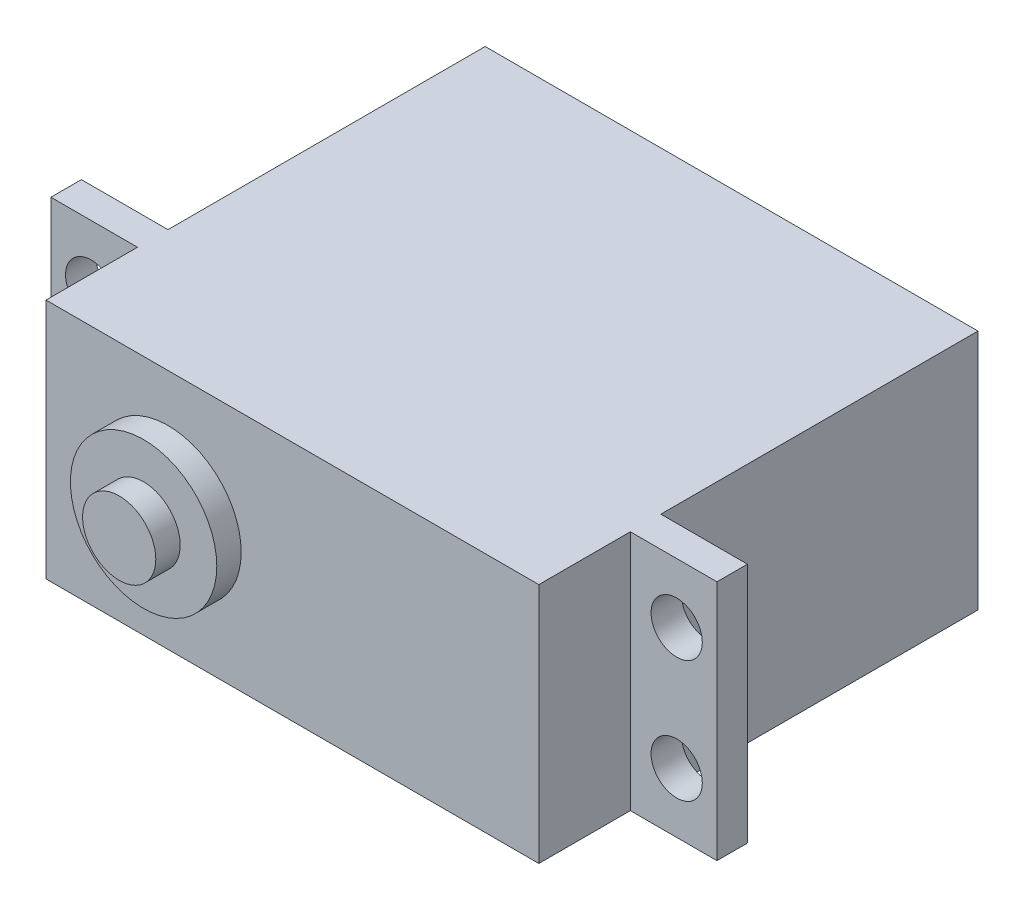
ISO-10303-21;
HEADER;
FILE_DESCRIPTION(('STEP AP214'),'2;1');
FILE_NAME('part.step','',(''),(''),'','','');
FILE_SCHEMA(('AUTOMOTIVE_DESIGN { 1 0 10303 214 1 1 1 1 }'));
ENDSEC;
DATA;
#1=APPLICATION_CONTEXT('core data for automotive mechanical design processes');
#2=APPLICATION_PROTOCOL_DEFINITION('international standard','automotive_design',2000,#1);
#3=PRODUCT_CONTEXT('',#1,'mechanical');
#4=PRODUCT('Part','Part','',(#3));
#5=PRODUCT_RELATED_PRODUCT_CATEGORY('part','',(#4));
#6=PRODUCT_DEFINITION_FORMATION('','',#4);
#7=PRODUCT_DEFINITION_CONTEXT('part definition',#1,'design');
#8=PRODUCT_DEFINITION('design','',#6,#7);
#9=PRODUCT_DEFINITION_SHAPE('','',#8);
#10=(LENGTH_UNIT() NAMED_UNIT(*) SI_UNIT(.MILLI.,.METRE.));
#11=(NAMED_UNIT(*) PLANE_ANGLE_UNIT() SI_UNIT($,.RADIAN.));
#12=(NAMED_UNIT(*) SI_UNIT($,.STERADIAN.) SOLID_ANGLE_UNIT());
#13=UNCERTAINTY_MEASURE_WITH_UNIT(LENGTH_MEASURE(1.E-05),#10,'distance_accuracy_value','');
#14=(GEOMETRIC_REPRESENTATION_CONTEXT(3) GLOBAL_UNCERTAINTY_ASSIGNED_CONTEXT((#13)) GLOBAL_UNIT_ASSIGNED_CONTEXT((#10,
#11,#12)) REPRESENTATION_CONTEXT('',''));
#15=CARTESIAN_POINT('',(0.,0.,0.));
#16=DIRECTION('',(0.,0.,1.));
#17=DIRECTION('',(1.,0.,0.));
#18=AXIS2_PLACEMENT_3D('',#15,#16,#17);
#19=CARTESIAN_POINT('',(30.4,-9.9,-26.));
#20=DIRECTION('',(1.,0.,0.));
#21=DIRECTION('',(0.,0.,-1.));
#22=AXIS2_PLACEMENT_3D('',#19,#20,#21);
#23=PLANE('',#22);
#24=DIRECTION('',(0.,0.,1.));
#25=VECTOR('',#24,1.);
#26=CARTESIAN_POINT('',(30.4,9.9,-26.));
#27=LINE('',#26,#25);
#28=CARTESIAN_POINT('',(30.4,9.9,-26.));
#29=VERTEX_POINT('',#28);
#30=CARTESIAN_POINT('',(30.4,9.9,0.));
#31=VERTEX_POINT('',#30);
#32=EDGE_CURVE('E237',#29,#31,#27,.T.);
#33=ORIENTED_EDGE('',*,*,#32,.T.);
#34=DIRECTION('',(0.,-1.,0.));
#35=VECTOR('',#34,1.);
#36=CARTESIAN_POINT('',(30.4,9.9,0.));
#37=LINE('',#36,#35);
#38=CARTESIAN_POINT('',(30.4,-9.9,0.));
#39=VERTEX_POINT('',#38);
#40=EDGE_CURVE('E57',#31,#39,#37,.T.);
#41=ORIENTED_EDGE('',*,*,#40,.T.);
#42=DIRECTION('',(0.,0.,1.));
#43=VECTOR('',#42,1.);
#44=CARTESIAN_POINT('',(30.4,-9.9,-26.));
#45=LINE('',#44,#43);
#46=CARTESIAN_POINT('',(30.4,-9.9,-26.));
#47=VERTEX_POINT('',#46);
#48=EDGE_CURVE('E136',#47,#39,#45,.T.);
#49=ORIENTED_EDGE('',*,*,#48,.F.);
#50=DIRECTION('',(0.,1.,0.));
#51=VECTOR('',#50,1.);
#52=CARTESIAN_POINT('',(30.4,-9.9,-26.));
#53=LINE('',#52,#51);
#54=EDGE_CURVE('E223',#47,#29,#53,.T.);
#55=ORIENTED_EDGE('',*,*,#54,.T.);
#56=EDGE_LOOP('',(#33,#41,#49,#55));
#57=FACE_BOUND('',#56,.T.);
#58=ADVANCED_FACE('F39',(#57),#23,.T.);
#59=CARTESIAN_POINT('',(-10.,9.9,-26.));
#60=DIRECTION('',(-1.,0.,0.));
#61=DIRECTION('',(0.,0.,1.));
#62=AXIS2_PLACEMENT_3D('',#59,#60,#61);
#63=PLANE('',#62);
#64=DIRECTION('',(0.,0.,1.));
#65=VECTOR('',#64,1.);
#66=CARTESIAN_POINT('',(-10.,-9.9,-26.));
#67=LINE('',#66,#65);
#68=CARTESIAN_POINT('',(-10.,-9.9,-26.));
#69=VERTEX_POINT('',#68);
#70=CARTESIAN_POINT('',(-10.,-9.9,0.));
#71=VERTEX_POINT('',#70);
#72=EDGE_CURVE('E43',#69,#71,#67,.T.);
#73=ORIENTED_EDGE('',*,*,#72,.T.);
#74=DIRECTION('',(0.,1.,0.));
#75=VECTOR('',#74,1.);
#76=CARTESIAN_POINT('',(-10.,-9.9,0.));
#77=LINE('',#76,#75);
#78=CARTESIAN_POINT('',(-10.,9.9,0.));
#79=VERTEX_POINT('',#78);
#80=EDGE_CURVE('E205',#71,#79,#77,.T.);
#81=ORIENTED_EDGE('',*,*,#80,.T.);
#82=DIRECTION('',(0.,0.,1.));
#83=VECTOR('',#82,1.);
#84=CARTESIAN_POINT('',(-10.,9.9,-26.));
#85=LINE('',#84,#83);
#86=CARTESIAN_POINT('',(-10.,9.9,-26.));
#87=VERTEX_POINT('',#86);
#88=EDGE_CURVE('E235',#87,#79,#85,.T.);
#89=ORIENTED_EDGE('',*,*,#88,.F.);
#90=DIRECTION('',(0.,-1.,0.));
#91=VECTOR('',#90,1.);
#92=CARTESIAN_POINT('',(-10.,9.9,-26.));
#93=LINE('',#92,#91);
#94=EDGE_CURVE('E218',#87,#69,#93,.T.);
#95=ORIENTED_EDGE('',*,*,#94,.T.);
#96=EDGE_LOOP('',(#73,#81,#89,#95));
#97=FACE_BOUND('',#96,.T.);
#98=ADVANCED_FACE('F254',(#97),#63,.T.);
#99=DIRECTION('',(0.,1.,0.));
#100=VECTOR('',#99,1.);
#101=CARTESIAN_POINT('',(-10.,-9.9,2.5));
#102=LINE('',#101,#100);
#103=CARTESIAN_POINT('',(-10.,-9.9,2.5));
#104=VERTEX_POINT('',#103);
#105=CARTESIAN_POINT('',(-10.,9.9,2.5));
#106=VERTEX_POINT('',#105);
#107=EDGE_CURVE('E191',#104,#106,#102,.T.);
#108=ORIENTED_EDGE('',*,*,#107,.F.);
#109=CARTESIAN_POINT('',(-10.,-9.9,10.));
#110=VERTEX_POINT('',#109);
#111=EDGE_CURVE('E231',#104,#110,#67,.T.);
#112=ORIENTED_EDGE('',*,*,#111,.T.);
#113=DIRECTION('',(0.,-1.,0.));
#114=VECTOR('',#113,1.);
#115=CARTESIAN_POINT('',(-10.,9.9,10.));
#116=LINE('',#115,#114);
#117=CARTESIAN_POINT('',(-10.,9.9,10.));
#118=VERTEX_POINT('',#117);
#119=EDGE_CURVE('E209',#118,#110,#116,.T.);
#120=ORIENTED_EDGE('',*,*,#119,.F.);
#121=EDGE_CURVE('E234',#106,#118,#85,.T.);
#122=ORIENTED_EDGE('',*,*,#121,.F.);
#123=EDGE_LOOP('',(#108,#112,#120,#122));
#124=FACE_BOUND('',#123,.T.);
#125=ADVANCED_FACE('F41',(#124),#63,.T.);
#126=CARTESIAN_POINT('',(30.4,9.9,-26.));
#127=DIRECTION('',(0.,1.,0.));
#128=DIRECTION('',(0.,0.,1.));
#129=AXIS2_PLACEMENT_3D('',#126,#127,#128);
#130=PLANE('',#129);
#131=ORIENTED_EDGE('',*,*,#88,.T.);
#132=DIRECTION('',(-1.,0.,0.));
#133=VECTOR('',#132,1.);
#134=CARTESIAN_POINT('',(-10.,9.9,0.));
#135=LINE('',#134,#133);
#136=CARTESIAN_POINT('',(-17.1,9.9,0.));
#137=VERTEX_POINT('',#136);
#138=EDGE_CURVE('E190',#79,#137,#135,.T.);
#139=ORIENTED_EDGE('',*,*,#138,.T.);
#140=DIRECTION('',(0.,0.,-1.));
#141=VECTOR('',#140,1.);
#142=CARTESIAN_POINT('',(-17.1,9.9,2.5));
#143=LINE('',#142,#141);
#144=CARTESIAN_POINT('',(-17.1,9.9,2.5));
#145=VERTEX_POINT('',#144);
#146=EDGE_CURVE('E198',#145,#137,#143,.T.);
#147=ORIENTED_EDGE('',*,*,#146,.F.);
#148=DIRECTION('',(-1.,0.,0.));
#149=VECTOR('',#148,1.);
#150=CARTESIAN_POINT('',(-10.,9.9,2.5));
#151=LINE('',#150,#149);
#152=EDGE_CURVE('E193',#106,#145,#151,.T.);
#153=ORIENTED_EDGE('',*,*,#152,.F.);
#154=ORIENTED_EDGE('',*,*,#121,.T.);
#155=DIRECTION('',(-1.,0.,0.));
#156=VECTOR('',#155,1.);
#157=CARTESIAN_POINT('',(30.4,9.9,10.));
#158=LINE('',#157,#156);
#159=CARTESIAN_POINT('',(30.4,9.9,10.));
#160=VERTEX_POINT('',#159);
#161=EDGE_CURVE('E216',#160,#118,#158,.T.);
#162=ORIENTED_EDGE('',*,*,#161,.F.);
#163=CARTESIAN_POINT('',(30.4,9.9,2.5));
#164=VERTEX_POINT('',#163);
#165=EDGE_CURVE('E240',#164,#160,#27,.T.);
#166=ORIENTED_EDGE('',*,*,#165,.F.);
#167=DIRECTION('',(-1.,0.,0.));
#168=VECTOR('',#167,1.);
#169=CARTESIAN_POINT('',(37.5,9.9,2.5));
#170=LINE('',#169,#168);
#171=CARTESIAN_POINT('',(37.5,9.9,2.5));
#172=VERTEX_POINT('',#171);
#173=EDGE_CURVE('E147',#172,#164,#170,.T.);
#174=ORIENTED_EDGE('',*,*,#173,.F.);
#175=DIRECTION('',(0.,0.,-1.));
#176=VECTOR('',#175,1.);
#177=CARTESIAN_POINT('',(37.5,9.9,2.5));
#178=LINE('',#177,#176);
#179=CARTESIAN_POINT('',(37.5,9.9,0.));
#180=VERTEX_POINT('',#179);
#181=EDGE_CURVE('E165',#172,#180,#178,.T.);
#182=ORIENTED_EDGE('',*,*,#181,.T.);
#183=DIRECTION('',(-1.,0.,0.));
#184=VECTOR('',#183,1.);
#185=CARTESIAN_POINT('',(37.5,9.9,0.));
#186=LINE('',#185,#184);
#187=EDGE_CURVE('E151',#180,#31,#186,.T.);
#188=ORIENTED_EDGE('',*,*,#187,.T.);
#189=ORIENTED_EDGE('',*,*,#32,.F.);
#190=DIRECTION('',(-1.,0.,0.));
#191=VECTOR('',#190,1.);
#192=CARTESIAN_POINT('',(30.4,9.9,-26.));
#193=LINE('',#192,#191);
#194=EDGE_CURVE('E230',#29,#87,#193,.T.);
#195=ORIENTED_EDGE('',*,*,#194,.T.);
#196=EDGE_LOOP('',(#131,#139,#147,#153,#154,#162,#166,#174,#182,#188,#189,#195));
#197=FACE_BOUND('',#196,.T.);
#198=ADVANCED_FACE('F241',(#197),#130,.T.);
#199=DIRECTION('',(0.,-1.,0.));
#200=VECTOR('',#199,1.);
#201=CARTESIAN_POINT('',(30.4,9.9,2.5));
#202=LINE('',#201,#200);
#203=CARTESIAN_POINT('',(30.4,-9.9,2.5));
#204=VERTEX_POINT('',#203);
#205=EDGE_CURVE('E61',#164,#204,#202,.T.);
#206=ORIENTED_EDGE('',*,*,#205,.F.);
#207=ORIENTED_EDGE('',*,*,#165,.T.);
#208=DIRECTION('',(0.,1.,0.));
#209=VECTOR('',#208,1.);
#210=CARTESIAN_POINT('',(30.4,-9.9,10.));
#211=LINE('',#210,#209);
#212=CARTESIAN_POINT('',(30.4,-9.9,10.));
#213=VERTEX_POINT('',#212);
#214=EDGE_CURVE('E134',#213,#160,#211,.T.);
#215=ORIENTED_EDGE('',*,*,#214,.F.);
#216=EDGE_CURVE('E126',#204,#213,#45,.T.);
#217=ORIENTED_EDGE('',*,*,#216,.F.);
#218=EDGE_LOOP('',(#206,#207,#215,#217));
#219=FACE_BOUND('',#218,.T.);
#220=ADVANCED_FACE('F128',(#219),#23,.T.);
#221=CARTESIAN_POINT('',(-10.,-9.9,-26.));
#222=DIRECTION('',(0.,-1.,0.));
#223=DIRECTION('',(0.,0.,-1.));
#224=AXIS2_PLACEMENT_3D('',#221,#222,#223);
#225=PLANE('',#224);
#226=ORIENTED_EDGE('',*,*,#48,.T.);
#227=DIRECTION('',(1.,0.,0.));
#228=VECTOR('',#227,1.);
#229=CARTESIAN_POINT('',(30.4,-9.9,0.));
#230=LINE('',#229,#228);
#231=CARTESIAN_POINT('',(37.5,-9.9,0.));
#232=VERTEX_POINT('',#231);
#233=EDGE_CURVE('E163',#39,#232,#230,.T.);
#234=ORIENTED_EDGE('',*,*,#233,.T.);
#235=DIRECTION('',(0.,0.,-1.));
#236=VECTOR('',#235,1.);
#237=CARTESIAN_POINT('',(37.5,-9.9,2.5));
#238=LINE('',#237,#236);
#239=CARTESIAN_POINT('',(37.5,-9.9,2.5));
#240=VERTEX_POINT('',#239);
#241=EDGE_CURVE('E143',#240,#232,#238,.T.);
#242=ORIENTED_EDGE('',*,*,#241,.F.);
#243=DIRECTION('',(1.,0.,0.));
#244=VECTOR('',#243,1.);
#245=CARTESIAN_POINT('',(30.4,-9.9,2.5));
#246=LINE('',#245,#244);
#247=EDGE_CURVE('E137',#204,#240,#246,.T.);
#248=ORIENTED_EDGE('',*,*,#247,.F.);
#249=ORIENTED_EDGE('',*,*,#216,.T.);
#250=DIRECTION('',(1.,0.,0.));
#251=VECTOR('',#250,1.);
#252=CARTESIAN_POINT('',(-10.,-9.9,10.));
#253=LINE('',#252,#251);
#254=EDGE_CURVE('E213',#110,#213,#253,.T.);
#255=ORIENTED_EDGE('',*,*,#254,.F.);
#256=ORIENTED_EDGE('',*,*,#111,.F.);
#257=DIRECTION('',(1.,0.,0.));
#258=VECTOR('',#257,1.);
#259=CARTESIAN_POINT('',(-17.1,-9.9,2.5));
#260=LINE('',#259,#258);
#261=CARTESIAN_POINT('',(-17.1,-9.9,2.5));
#262=VERTEX_POINT('',#261);
#263=EDGE_CURVE('E189',#262,#104,#260,.T.);
#264=ORIENTED_EDGE('',*,*,#263,.F.);
#265=DIRECTION('',(0.,0.,-1.));
#266=VECTOR('',#265,1.);
#267=CARTESIAN_POINT('',(-17.1,-9.9,2.5));
#268=LINE('',#267,#266);
#269=CARTESIAN_POINT('',(-17.1,-9.9,0.));
#270=VERTEX_POINT('',#269);
#271=EDGE_CURVE('E210',#262,#270,#268,.T.);
#272=ORIENTED_EDGE('',*,*,#271,.T.);
#273=DIRECTION('',(1.,0.,0.));
#274=VECTOR('',#273,1.);
#275=CARTESIAN_POINT('',(-17.1,-9.9,0.));
#276=LINE('',#275,#274);
#277=EDGE_CURVE('E200',#270,#71,#276,.T.);
#278=ORIENTED_EDGE('',*,*,#277,.T.);
#279=ORIENTED_EDGE('',*,*,#72,.F.);
#280=DIRECTION('',(1.,0.,0.));
#281=VECTOR('',#280,1.);
#282=CARTESIAN_POINT('',(-10.,-9.9,-26.));
#283=LINE('',#282,#281);
#284=EDGE_CURVE('E225',#69,#47,#283,.T.);
#285=ORIENTED_EDGE('',*,*,#284,.T.);
#286=EDGE_LOOP('',(#226,#234,#242,#248,#249,#255,#256,#264,#272,#278,#279,#285));
#287=FACE_BOUND('',#286,.T.);
#288=ADVANCED_FACE('F138',(#287),#225,.T.);
#289=CARTESIAN_POINT('',(0.,0.,-26.));
#290=DIRECTION('',(0.,0.,1.));
#291=DIRECTION('',(1.,0.,0.));
#292=AXIS2_PLACEMENT_3D('',#289,#290,#291);
#293=PLANE('',#292);
#294=ORIENTED_EDGE('',*,*,#94,.F.);
#295=ORIENTED_EDGE('',*,*,#194,.F.);
#296=ORIENTED_EDGE('',*,*,#54,.F.);
#297=ORIENTED_EDGE('',*,*,#284,.F.);
#298=EDGE_LOOP('',(#294,#295,#296,#297));
#299=FACE_BOUND('',#298,.T.);
#300=ADVANCED_FACE('F289',(#299),#293,.F.);
#301=CARTESIAN_POINT('',(0.,0.,10.));
#302=DIRECTION('',(0.,0.,1.));
#303=DIRECTION('',(1.,0.,0.));
#304=AXIS2_PLACEMENT_3D('',#301,#302,#303);
#305=PLANE('',#304);
#306=CARTESIAN_POINT('',(0.,0.,10.));
#307=DIRECTION('',(0.,0.,1.));
#308=DIRECTION('',(1.,0.,0.));
#309=AXIS2_PLACEMENT_3D('',#306,#307,#308);
#310=CIRCLE('',#309,6.);
#311=CARTESIAN_POINT('',(6.,0.,10.));
#312=VERTEX_POINT('',#311);
#313=EDGE_CURVE('E48',#312,#312,#310,.T.);
#314=ORIENTED_EDGE('',*,*,#313,.F.);
#315=EDGE_LOOP('',(#314));
#316=FACE_BOUND('',#315,.T.);
#317=ORIENTED_EDGE('',*,*,#119,.T.);
#318=ORIENTED_EDGE('',*,*,#254,.T.);
#319=ORIENTED_EDGE('',*,*,#214,.T.);
#320=ORIENTED_EDGE('',*,*,#161,.T.);
#321=EDGE_LOOP('',(#317,#318,#319,#320));
#322=FACE_BOUND('',#321,.T.);
#323=ADVANCED_FACE('F244',(#316,#322),#305,.T.);
#324=CARTESIAN_POINT('',(0.,0.,2.5));
#325=DIRECTION('',(0.,0.,1.));
#326=DIRECTION('',(1.,0.,0.));
#327=AXIS2_PLACEMENT_3D('',#324,#325,#326);
#328=PLANE('',#327);
#329=CARTESIAN_POINT('',(-13.8,5.,2.5));
#330=DIRECTION('',(0.,0.,1.));
#331=DIRECTION('',(1.,0.,0.));
#332=AXIS2_PLACEMENT_3D('',#329,#330,#331);
#333=CIRCLE('',#332,2.1);
#334=CARTESIAN_POINT('',(-11.7,5.,2.5));
#335=VERTEX_POINT('',#334);
#336=EDGE_CURVE('E177',#335,#335,#333,.T.);
#337=ORIENTED_EDGE('',*,*,#336,.F.);
#338=EDGE_LOOP('',(#337));
#339=FACE_BOUND('',#338,.T.);
#340=DIRECTION('',(0.,-1.,0.));
#341=VECTOR('',#340,1.);
#342=CARTESIAN_POINT('',(-17.1,9.9,2.5));
#343=LINE('',#342,#341);
#344=EDGE_CURVE('E184',#145,#262,#343,.T.);
#345=ORIENTED_EDGE('',*,*,#344,.T.);
#346=ORIENTED_EDGE('',*,*,#263,.T.);
#347=ORIENTED_EDGE('',*,*,#107,.T.);
#348=ORIENTED_EDGE('',*,*,#152,.T.);
#349=EDGE_LOOP('',(#345,#346,#347,#348));
#350=FACE_BOUND('',#349,.T.);
#351=CARTESIAN_POINT('',(-13.8,-5.,2.5));
#352=DIRECTION('',(0.,0.,1.));
#353=DIRECTION('',(1.,0.,0.));
#354=AXIS2_PLACEMENT_3D('',#351,#352,#353);
#355=CIRCLE('',#354,2.1);
#356=CARTESIAN_POINT('',(-11.7,-5.,2.5));
#357=VERTEX_POINT('',#356);
#358=EDGE_CURVE('E174',#357,#357,#355,.T.);
#359=ORIENTED_EDGE('',*,*,#358,.F.);
#360=EDGE_LOOP('',(#359));
#361=FACE_BOUND('',#360,.T.);
#362=ADVANCED_FACE('F249',(#339,#350,#361),#328,.T.);
#363=CARTESIAN_POINT('',(0.,0.,0.));
#364=DIRECTION('',(0.,0.,1.));
#365=DIRECTION('',(1.,0.,0.));
#366=AXIS2_PLACEMENT_3D('',#363,#364,#365);
#367=PLANE('',#366);
#368=DIRECTION('',(0.,-1.,0.));
#369=VECTOR('',#368,1.);
#370=CARTESIAN_POINT('',(-17.1,9.9,0.));
#371=LINE('',#370,#369);
#372=EDGE_CURVE('E182',#137,#270,#371,.T.);
#373=ORIENTED_EDGE('',*,*,#372,.F.);
#374=ORIENTED_EDGE('',*,*,#138,.F.);
#375=ORIENTED_EDGE('',*,*,#80,.F.);
#376=ORIENTED_EDGE('',*,*,#277,.F.);
#377=EDGE_LOOP('',(#373,#374,#375,#376));
#378=FACE_BOUND('',#377,.T.);
#379=CARTESIAN_POINT('',(-13.8,5.,0.));
#380=DIRECTION('',(0.,0.,1.));
#381=DIRECTION('',(1.,0.,0.));
#382=AXIS2_PLACEMENT_3D('',#379,#380,#381);
#383=CIRCLE('',#382,2.1);
#384=CARTESIAN_POINT('',(-11.7,5.,0.));
#385=VERTEX_POINT('',#384);
#386=EDGE_CURVE('E173',#385,#385,#383,.T.);
#387=ORIENTED_EDGE('',*,*,#386,.T.);
#388=EDGE_LOOP('',(#387));
#389=FACE_BOUND('',#388,.T.);
#390=CARTESIAN_POINT('',(-13.8,-5.,0.));
#391=DIRECTION('',(0.,0.,1.));
#392=DIRECTION('',(1.,0.,0.));
#393=AXIS2_PLACEMENT_3D('',#390,#391,#392);
#394=CIRCLE('',#393,2.1);
#395=CARTESIAN_POINT('',(-11.7,-5.,0.));
#396=VERTEX_POINT('',#395);
#397=EDGE_CURVE('E172',#396,#396,#394,.T.);
#398=ORIENTED_EDGE('',*,*,#397,.T.);
#399=EDGE_LOOP('',(#398));
#400=FACE_BOUND('',#399,.T.);
#401=ADVANCED_FACE('F265',(#378,#389,#400),#367,.F.);
#402=CARTESIAN_POINT('',(-17.1,9.9,2.5));
#403=DIRECTION('',(1.,0.,0.));
#404=DIRECTION('',(0.,0.,-1.));
#405=AXIS2_PLACEMENT_3D('',#402,#403,#404);
#406=PLANE('',#405);
#407=ORIENTED_EDGE('',*,*,#372,.T.);
#408=ORIENTED_EDGE('',*,*,#271,.F.);
#409=ORIENTED_EDGE('',*,*,#344,.F.);
#410=ORIENTED_EDGE('',*,*,#146,.T.);
#411=EDGE_LOOP('',(#407,#408,#409,#410));
#412=FACE_BOUND('',#411,.T.);
#413=ADVANCED_FACE('F264',(#412),#406,.F.);
#414=CARTESIAN_POINT('',(-13.8,5.,2.5));
#415=DIRECTION('',(0.,0.,-1.));
#416=DIRECTION('',(-1.,0.,0.));
#417=AXIS2_PLACEMENT_3D('',#414,#415,#416);
#418=CYLINDRICAL_SURFACE('',#417,2.1);
#419=ORIENTED_EDGE('',*,*,#336,.T.);
#420=EDGE_LOOP('',(#419));
#421=FACE_BOUND('',#420,.T.);
#422=ORIENTED_EDGE('',*,*,#386,.F.);
#423=EDGE_LOOP('',(#422));
#424=FACE_BOUND('',#423,.T.);
#425=ADVANCED_FACE('F270',(#421,#424),#418,.F.);
#426=CARTESIAN_POINT('',(-13.8,-5.,2.5));
#427=DIRECTION('',(0.,0.,-1.));
#428=DIRECTION('',(-1.,0.,0.));
#429=AXIS2_PLACEMENT_3D('',#426,#427,#428);
#430=CYLINDRICAL_SURFACE('',#429,2.1);
#431=ORIENTED_EDGE('',*,*,#358,.T.);
#432=EDGE_LOOP('',(#431));
#433=FACE_BOUND('',#432,.T.);
#434=ORIENTED_EDGE('',*,*,#397,.F.);
#435=EDGE_LOOP('',(#434));
#436=FACE_BOUND('',#435,.T.);
#437=ADVANCED_FACE('F272',(#433,#436),#430,.F.);
#438=CARTESIAN_POINT('',(0.,0.,2.5));
#439=DIRECTION('',(0.,0.,1.));
#440=DIRECTION('',(1.,0.,0.));
#441=AXIS2_PLACEMENT_3D('',#438,#439,#440);
#442=PLANE('',#441);
#443=CARTESIAN_POINT('',(34.2,5.,2.5));
#444=DIRECTION('',(0.,0.,1.));
#445=DIRECTION('',(1.,0.,0.));
#446=AXIS2_PLACEMENT_3D('',#443,#444,#445);
#447=CIRCLE('',#446,2.1);
#448=CARTESIAN_POINT('',(36.3,5.,2.5));
#449=VERTEX_POINT('',#448);
#450=EDGE_CURVE('E164',#449,#449,#447,.T.);
#451=ORIENTED_EDGE('',*,*,#450,.F.);
#452=EDGE_LOOP('',(#451));
#453=FACE_BOUND('',#452,.T.);
#454=ORIENTED_EDGE('',*,*,#205,.T.);
#455=ORIENTED_EDGE('',*,*,#247,.T.);
#456=DIRECTION('',(0.,1.,0.));
#457=VECTOR('',#456,1.);
#458=CARTESIAN_POINT('',(37.5,-9.9,2.5));
#459=LINE('',#458,#457);
#460=EDGE_CURVE('E145',#240,#172,#459,.T.);
#461=ORIENTED_EDGE('',*,*,#460,.T.);
#462=ORIENTED_EDGE('',*,*,#173,.T.);
#463=EDGE_LOOP('',(#454,#455,#461,#462));
#464=FACE_BOUND('',#463,.T.);
#465=CARTESIAN_POINT('',(34.2,-5.,2.5));
#466=DIRECTION('',(0.,0.,1.));
#467=DIRECTION('',(1.,0.,0.));
#468=AXIS2_PLACEMENT_3D('',#465,#466,#467);
#469=CIRCLE('',#468,2.1);
#470=CARTESIAN_POINT('',(36.3,-5.,2.5));
#471=VERTEX_POINT('',#470);
#472=EDGE_CURVE('E311',#471,#471,#469,.T.);
#473=ORIENTED_EDGE('',*,*,#472,.F.);
#474=EDGE_LOOP('',(#473));
#475=FACE_BOUND('',#474,.T.);
#476=ADVANCED_FACE('F150',(#453,#464,#475),#442,.T.);
#477=CARTESIAN_POINT('',(0.,0.,0.));
#478=DIRECTION('',(0.,0.,1.));
#479=DIRECTION('',(1.,0.,0.));
#480=AXIS2_PLACEMENT_3D('',#477,#478,#479);
#481=PLANE('',#480);
#482=ORIENTED_EDGE('',*,*,#40,.F.);
#483=ORIENTED_EDGE('',*,*,#187,.F.);
#484=DIRECTION('',(0.,1.,0.));
#485=VECTOR('',#484,1.);
#486=CARTESIAN_POINT('',(37.5,-9.9,0.));
#487=LINE('',#486,#485);
#488=EDGE_CURVE('E152',#232,#180,#487,.T.);
#489=ORIENTED_EDGE('',*,*,#488,.F.);
#490=ORIENTED_EDGE('',*,*,#233,.F.);
#491=EDGE_LOOP('',(#482,#483,#489,#490));
#492=FACE_BOUND('',#491,.T.);
#493=CARTESIAN_POINT('',(34.2,5.,0.));
#494=DIRECTION('',(0.,0.,1.));
#495=DIRECTION('',(1.,0.,0.));
#496=AXIS2_PLACEMENT_3D('',#493,#494,#495);
#497=CIRCLE('',#496,2.1);
#498=CARTESIAN_POINT('',(36.3,5.,0.));
#499=VERTEX_POINT('',#498);
#500=EDGE_CURVE('E160',#499,#499,#497,.T.);
#501=ORIENTED_EDGE('',*,*,#500,.T.);
#502=EDGE_LOOP('',(#501));
#503=FACE_BOUND('',#502,.T.);
#504=CARTESIAN_POINT('',(34.2,-5.,0.));
#505=DIRECTION('',(0.,0.,1.));
#506=DIRECTION('',(1.,0.,0.));
#507=AXIS2_PLACEMENT_3D('',#504,#505,#506);
#508=CIRCLE('',#507,2.1);
#509=CARTESIAN_POINT('',(36.3,-5.,0.));
#510=VERTEX_POINT('',#509);
#511=EDGE_CURVE('E316',#510,#510,#508,.T.);
#512=ORIENTED_EDGE('',*,*,#511,.T.);
#513=EDGE_LOOP('',(#512));
#514=FACE_BOUND('',#513,.T.);
#515=ADVANCED_FACE('F322',(#492,#503,#514),#481,.F.);
#516=CARTESIAN_POINT('',(37.5,-9.9,2.5));
#517=DIRECTION('',(-1.,0.,0.));
#518=DIRECTION('',(0.,0.,1.));
#519=AXIS2_PLACEMENT_3D('',#516,#517,#518);
#520=PLANE('',#519);
#521=ORIENTED_EDGE('',*,*,#488,.T.);
#522=ORIENTED_EDGE('',*,*,#181,.F.);
#523=ORIENTED_EDGE('',*,*,#460,.F.);
#524=ORIENTED_EDGE('',*,*,#241,.T.);
#525=EDGE_LOOP('',(#521,#522,#523,#524));
#526=FACE_BOUND('',#525,.T.);
#527=ADVANCED_FACE('F329',(#526),#520,.F.);
#528=CARTESIAN_POINT('',(34.2,5.,2.5));
#529=DIRECTION('',(0.,0.,-1.));
#530=DIRECTION('',(-1.,0.,0.));
#531=AXIS2_PLACEMENT_3D('',#528,#529,#530);
#532=CYLINDRICAL_SURFACE('',#531,2.1);
#533=ORIENTED_EDGE('',*,*,#450,.T.);
#534=EDGE_LOOP('',(#533));
#535=FACE_BOUND('',#534,.T.);
#536=ORIENTED_EDGE('',*,*,#500,.F.);
#537=EDGE_LOOP('',(#536));
#538=FACE_BOUND('',#537,.T.);
#539=ADVANCED_FACE('F330',(#535,#538),#532,.F.);
#540=CARTESIAN_POINT('',(34.2,-5.,2.5));
#541=DIRECTION('',(0.,0.,-1.));
#542=DIRECTION('',(-1.,0.,0.));
#543=AXIS2_PLACEMENT_3D('',#540,#541,#542);
#544=CYLINDRICAL_SURFACE('',#543,2.1);
#545=ORIENTED_EDGE('',*,*,#472,.T.);
#546=EDGE_LOOP('',(#545));
#547=FACE_BOUND('',#546,.T.);
#548=ORIENTED_EDGE('',*,*,#511,.F.);
#549=EDGE_LOOP('',(#548));
#550=FACE_BOUND('',#549,.T.);
#551=ADVANCED_FACE('F328',(#547,#550),#544,.F.);
#552=CARTESIAN_POINT('',(0.,0.,12.));
#553=DIRECTION('',(0.,0.,-1.));
#554=DIRECTION('',(-1.,0.,0.));
#555=AXIS2_PLACEMENT_3D('',#552,#553,#554);
#556=CYLINDRICAL_SURFACE('',#555,6.);
#557=CARTESIAN_POINT('',(0.,0.,12.));
#558=DIRECTION('',(0.,0.,1.));
#559=DIRECTION('',(1.,0.,0.));
#560=AXIS2_PLACEMENT_3D('',#557,#558,#559);
#561=CIRCLE('',#560,6.);
#562=CARTESIAN_POINT('',(6.,0.,12.));
#563=VERTEX_POINT('',#562);
#564=EDGE_CURVE('E315',#563,#563,#561,.T.);
#565=ORIENTED_EDGE('',*,*,#564,.F.);
#566=EDGE_LOOP('',(#565));
#567=FACE_BOUND('',#566,.T.);
#568=ORIENTED_EDGE('',*,*,#313,.T.);
#569=EDGE_LOOP('',(#568));
#570=FACE_BOUND('',#569,.T.);
#571=ADVANCED_FACE('F333',(#567,#570),#556,.T.);
#572=CARTESIAN_POINT('',(0.,0.,12.));
#573=DIRECTION('',(0.,0.,1.));
#574=DIRECTION('',(1.,0.,0.));
#575=AXIS2_PLACEMENT_3D('',#572,#573,#574);
#576=PLANE('',#575);
#577=CARTESIAN_POINT('',(0.,0.,12.));
#578=DIRECTION('',(0.,0.,1.));
#579=DIRECTION('',(1.,0.,0.));
#580=AXIS2_PLACEMENT_3D('',#577,#578,#579);
#581=CIRCLE('',#580,3.);
#582=CARTESIAN_POINT('',(3.,0.,12.));
#583=VERTEX_POINT('',#582);
#584=EDGE_CURVE('E11',#583,#583,#581,.T.);
#585=ORIENTED_EDGE('',*,*,#584,.F.);
#586=EDGE_LOOP('',(#585));
#587=FACE_BOUND('',#586,.T.);
#588=ORIENTED_EDGE('',*,*,#564,.T.);
#589=EDGE_LOOP('',(#588));
#590=FACE_BOUND('',#589,.T.);
#591=ADVANCED_FACE('F458',(#587,#590),#576,.T.);
#592=CARTESIAN_POINT('',(0.,0.,14.));
#593=DIRECTION('',(0.,0.,-1.));
#594=DIRECTION('',(-1.,0.,0.));
#595=AXIS2_PLACEMENT_3D('',#592,#593,#594);
#596=CYLINDRICAL_SURFACE('',#595,3.);
#597=CARTESIAN_POINT('',(0.,0.,14.));
#598=DIRECTION('',(0.,0.,1.));
#599=DIRECTION('',(1.,0.,0.));
#600=AXIS2_PLACEMENT_3D('',#597,#598,#599);
#601=CIRCLE('',#600,3.);
#602=CARTESIAN_POINT('',(3.,0.,14.));
#603=VERTEX_POINT('',#602);
#604=EDGE_CURVE('E494',#603,#603,#601,.T.);
#605=ORIENTED_EDGE('',*,*,#604,.F.);
#606=EDGE_LOOP('',(#605));
#607=FACE_BOUND('',#606,.T.);
#608=ORIENTED_EDGE('',*,*,#584,.T.);
#609=EDGE_LOOP('',(#608));
#610=FACE_BOUND('',#609,.T.);
#611=ADVANCED_FACE('F467',(#607,#610),#596,.T.);
#612=CARTESIAN_POINT('',(0.,0.,14.));
#613=DIRECTION('',(0.,0.,1.));
#614=DIRECTION('',(1.,0.,0.));
#615=AXIS2_PLACEMENT_3D('',#612,#613,#614);
#616=PLANE('',#615);
#617=ORIENTED_EDGE('',*,*,#604,.T.);
#618=EDGE_LOOP('',(#617));
#619=FACE_BOUND('',#618,.T.);
#620=ADVANCED_FACE('F480',(#619),#616,.T.);
#621=CLOSED_SHELL('',(#58,#98,#125,#198,#220,#288,#300,#323,#362,#401,#413,#425,#437,#476,#515,
#527,#539,#551,#571,#591,#611,#620));
#622=MANIFOLD_SOLID_BREP('B2',#621);
#623=ADVANCED_BREP_SHAPE_REPRESENTATION('',(#18,#622),#14);
#624=SHAPE_DEFINITION_REPRESENTATION(#9,#623);
ENDSEC;
END-ISO-10303-21;
